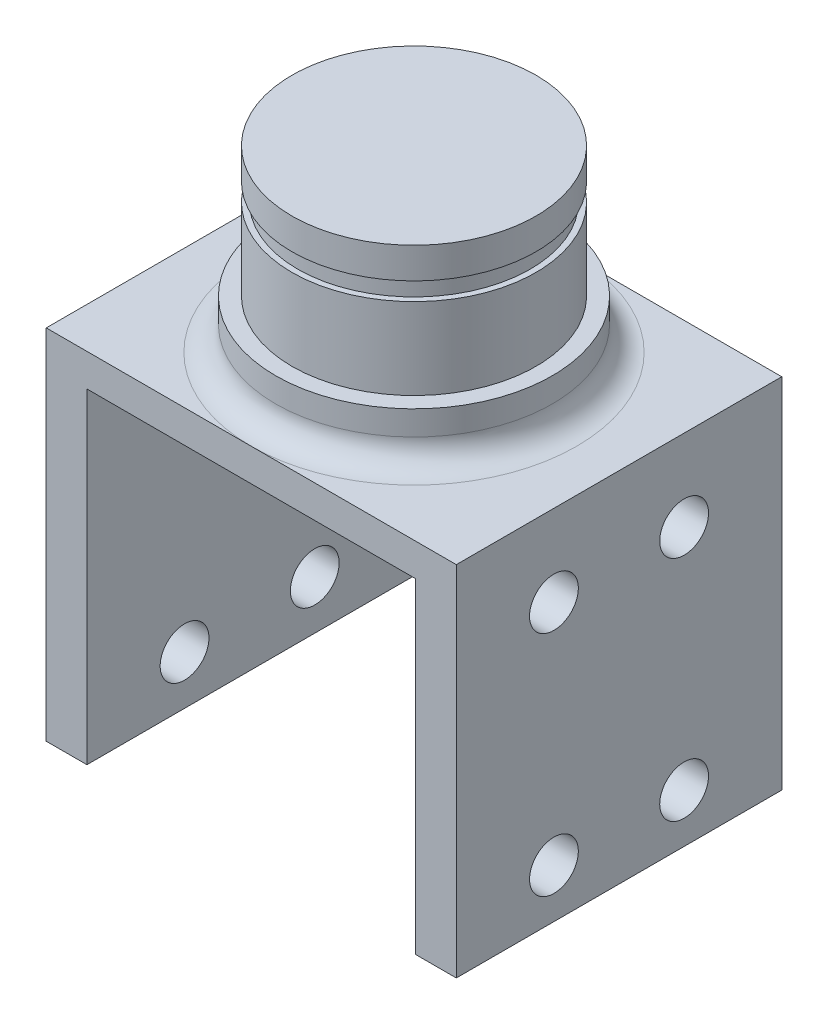
ISO-10303-21;
HEADER;
FILE_DESCRIPTION(('STEP AP214'),'2;1');
FILE_NAME('part.step','',(''),(''),'','','');
FILE_SCHEMA(('AUTOMOTIVE_DESIGN { 1 0 10303 214 1 1 1 1 }'));
ENDSEC;
DATA;
#1=APPLICATION_CONTEXT('core data for automotive mechanical design processes');
#2=APPLICATION_PROTOCOL_DEFINITION('international standard','automotive_design',2000,#1);
#3=PRODUCT_CONTEXT('',#1,'mechanical');
#4=PRODUCT('Part','Part','',(#3));
#5=PRODUCT_RELATED_PRODUCT_CATEGORY('part','',(#4));
#6=PRODUCT_DEFINITION_FORMATION('','',#4);
#7=PRODUCT_DEFINITION_CONTEXT('part definition',#1,'design');
#8=PRODUCT_DEFINITION('design','',#6,#7);
#9=PRODUCT_DEFINITION_SHAPE('','',#8);
#10=(LENGTH_UNIT() NAMED_UNIT(*) SI_UNIT(.MILLI.,.METRE.));
#11=(NAMED_UNIT(*) PLANE_ANGLE_UNIT() SI_UNIT($,.RADIAN.));
#12=(NAMED_UNIT(*) SI_UNIT($,.STERADIAN.) SOLID_ANGLE_UNIT());
#13=UNCERTAINTY_MEASURE_WITH_UNIT(LENGTH_MEASURE(1.E-05),#10,'distance_accuracy_value','');
#14=(GEOMETRIC_REPRESENTATION_CONTEXT(3) GLOBAL_UNCERTAINTY_ASSIGNED_CONTEXT((#13)) GLOBAL_UNIT_ASSIGNED_CONTEXT((#10,
#11,#12)) REPRESENTATION_CONTEXT('',''));
#15=CARTESIAN_POINT('',(0.,0.,0.));
#16=DIRECTION('',(0.,0.,1.));
#17=DIRECTION('',(1.,0.,0.));
#18=AXIS2_PLACEMENT_3D('',#15,#16,#17);
#19=CARTESIAN_POINT('',(0.,13.,0.));
#20=DIRECTION('',(0.,-1.,0.));
#21=DIRECTION('',(0.,0.,-1.));
#22=AXIS2_PLACEMENT_3D('',#19,#20,#21);
#23=CYLINDRICAL_SURFACE('',#22,7.5);
#24=CARTESIAN_POINT('',(0.,5.,0.));
#25=DIRECTION('',(0.,1.,0.));
#26=DIRECTION('',(0.,0.,1.));
#27=AXIS2_PLACEMENT_3D('',#24,#25,#26);
#28=CIRCLE('',#27,7.5);
#29=CARTESIAN_POINT('',(0.,5.,7.5));
#30=VERTEX_POINT('',#29);
#31=EDGE_CURVE('E174',#30,#30,#28,.T.);
#32=ORIENTED_EDGE('',*,*,#31,.T.);
#33=EDGE_LOOP('',(#32));
#34=FACE_BOUND('',#33,.T.);
#35=CARTESIAN_POINT('',(0.,10.,0.));
#36=DIRECTION('',(0.,1.,0.));
#37=DIRECTION('',(0.,0.,1.));
#38=AXIS2_PLACEMENT_3D('',#35,#36,#37);
#39=CIRCLE('',#38,7.5);
#40=CARTESIAN_POINT('',(0.,10.,7.5));
#41=VERTEX_POINT('',#40);
#42=EDGE_CURVE('E310',#41,#41,#39,.T.);
#43=ORIENTED_EDGE('',*,*,#42,.F.);
#44=EDGE_LOOP('',(#43));
#45=FACE_BOUND('',#44,.T.);
#46=ADVANCED_FACE('F33',(#34,#45),#23,.T.);
#47=CARTESIAN_POINT('',(0.,2.,0.));
#48=DIRECTION('',(0.,-1.,0.));
#49=DIRECTION('',(0.,0.,-1.));
#50=AXIS2_PLACEMENT_3D('',#47,#48,#49);
#51=PLANE('',#50);
#52=DIRECTION('',(1.,0.,0.));
#53=VECTOR('',#52,1.);
#54=CARTESIAN_POINT('',(12.6,2.,10.));
#55=LINE('',#54,#53);
#56=CARTESIAN_POINT('',(-12.6,2.,10.));
#57=VERTEX_POINT('',#56);
#58=CARTESIAN_POINT('',(0.,2.,10.));
#59=VERTEX_POINT('',#58);
#60=EDGE_CURVE('E156',#57,#59,#55,.T.);
#61=ORIENTED_EDGE('',*,*,#60,.T.);
#62=CARTESIAN_POINT('',(0.,2.,0.));
#63=DIRECTION('',(0.,-1.,0.));
#64=DIRECTION('',(0.,0.,-1.));
#65=AXIS2_PLACEMENT_3D('',#62,#63,#64);
#66=CIRCLE('',#65,10.);
#67=CARTESIAN_POINT('',(0.,2.,-10.));
#68=VERTEX_POINT('',#67);
#69=EDGE_CURVE('E11',#59,#68,#66,.T.);
#70=ORIENTED_EDGE('',*,*,#69,.T.);
#71=DIRECTION('',(-1.,0.,0.));
#72=VECTOR('',#71,1.);
#73=CARTESIAN_POINT('',(12.6,2.,-10.));
#74=LINE('',#73,#72);
#75=CARTESIAN_POINT('',(-12.6,2.,-10.));
#76=VERTEX_POINT('',#75);
#77=EDGE_CURVE('E161',#68,#76,#74,.T.);
#78=ORIENTED_EDGE('',*,*,#77,.T.);
#79=DIRECTION('',(0.,0.,1.));
#80=VECTOR('',#79,1.);
#81=CARTESIAN_POINT('',(-12.6,2.,-10.));
#82=LINE('',#81,#80);
#83=EDGE_CURVE('E151',#76,#57,#82,.T.);
#84=ORIENTED_EDGE('',*,*,#83,.T.);
#85=EDGE_LOOP('',(#61,#70,#78,#84));
#86=FACE_BOUND('',#85,.T.);
#87=ADVANCED_FACE('F278',(#86),#51,.F.);
#88=CARTESIAN_POINT('',(0.,0.,0.));
#89=DIRECTION('',(0.,-1.,0.));
#90=DIRECTION('',(0.,0.,-1.));
#91=AXIS2_PLACEMENT_3D('',#88,#89,#90);
#92=PLANE('',#91);
#93=DIRECTION('',(-1.,0.,0.));
#94=VECTOR('',#93,1.);
#95=CARTESIAN_POINT('',(12.6,0.,-10.));
#96=LINE('',#95,#94);
#97=CARTESIAN_POINT('',(10.1,0.,-9.99999999999999));
#98=VERTEX_POINT('',#97);
#99=CARTESIAN_POINT('',(-10.1,0.,-10.));
#100=VERTEX_POINT('',#99);
#101=EDGE_CURVE('E155',#98,#100,#96,.T.);
#102=ORIENTED_EDGE('',*,*,#101,.F.);
#103=DIRECTION('',(0.,0.,-1.));
#104=VECTOR('',#103,1.);
#105=CARTESIAN_POINT('',(10.1,0.,10.));
#106=LINE('',#105,#104);
#107=CARTESIAN_POINT('',(10.1,0.,10.));
#108=VERTEX_POINT('',#107);
#109=EDGE_CURVE('E121',#108,#98,#106,.T.);
#110=ORIENTED_EDGE('',*,*,#109,.F.);
#111=DIRECTION('',(1.,0.,0.));
#112=VECTOR('',#111,1.);
#113=CARTESIAN_POINT('',(12.6,0.,10.));
#114=LINE('',#113,#112);
#115=CARTESIAN_POINT('',(-10.1,0.,10.));
#116=VERTEX_POINT('',#115);
#117=EDGE_CURVE('E150',#116,#108,#114,.T.);
#118=ORIENTED_EDGE('',*,*,#117,.F.);
#119=DIRECTION('',(0.,0.,1.));
#120=VECTOR('',#119,1.);
#121=CARTESIAN_POINT('',(-10.1,0.,10.));
#122=LINE('',#121,#120);
#123=EDGE_CURVE('E126',#100,#116,#122,.T.);
#124=ORIENTED_EDGE('',*,*,#123,.F.);
#125=EDGE_LOOP('',(#102,#110,#118,#124));
#126=FACE_BOUND('',#125,.T.);
#127=ADVANCED_FACE('F245',(#126),#92,.T.);
#128=CARTESIAN_POINT('',(-12.6,2.,-10.));
#129=DIRECTION('',(1.,0.,0.));
#130=DIRECTION('',(0.,0.,-1.));
#131=AXIS2_PLACEMENT_3D('',#128,#129,#130);
#132=PLANE('',#131);
#133=CARTESIAN_POINT('',(-12.6,-3.,4.));
#134=DIRECTION('',(1.,0.,0.));
#135=DIRECTION('',(0.,0.,1.));
#136=AXIS2_PLACEMENT_3D('',#133,#134,#135);
#137=CIRCLE('',#136,1.5);
#138=CARTESIAN_POINT('',(-12.6,-3.,5.5));
#139=VERTEX_POINT('',#138);
#140=EDGE_CURVE('E221',#139,#139,#137,.T.);
#141=ORIENTED_EDGE('',*,*,#140,.T.);
#142=EDGE_LOOP('',(#141));
#143=FACE_BOUND('',#142,.T.);
#144=CARTESIAN_POINT('',(-12.6,-3.,-4.));
#145=DIRECTION('',(1.,0.,0.));
#146=DIRECTION('',(0.,0.,-1.));
#147=AXIS2_PLACEMENT_3D('',#144,#145,#146);
#148=CIRCLE('',#147,1.50000000000002);
#149=CARTESIAN_POINT('',(-12.6,-3.,-5.50000000000002));
#150=VERTEX_POINT('',#149);
#151=EDGE_CURVE('E215',#150,#150,#148,.T.);
#152=ORIENTED_EDGE('',*,*,#151,.T.);
#153=EDGE_LOOP('',(#152));
#154=FACE_BOUND('',#153,.T.);
#155=CARTESIAN_POINT('',(-12.6,-17.,-4.));
#156=DIRECTION('',(1.,0.,0.));
#157=DIRECTION('',(0.,0.,1.));
#158=AXIS2_PLACEMENT_3D('',#155,#156,#157);
#159=CIRCLE('',#158,1.50000000000002);
#160=CARTESIAN_POINT('',(-12.6,-17.,-2.49999999999998));
#161=VERTEX_POINT('',#160);
#162=EDGE_CURVE('E208',#161,#161,#159,.T.);
#163=ORIENTED_EDGE('',*,*,#162,.T.);
#164=EDGE_LOOP('',(#163));
#165=FACE_BOUND('',#164,.T.);
#166=CARTESIAN_POINT('',(-12.6,-17.,4.));
#167=DIRECTION('',(1.,0.,0.));
#168=DIRECTION('',(0.,0.,-1.));
#169=AXIS2_PLACEMENT_3D('',#166,#167,#168);
#170=CIRCLE('',#169,1.5);
#171=CARTESIAN_POINT('',(-12.6,-17.,2.50000000000001));
#172=VERTEX_POINT('',#171);
#173=EDGE_CURVE('E179',#172,#172,#170,.T.);
#174=ORIENTED_EDGE('',*,*,#173,.T.);
#175=EDGE_LOOP('',(#174));
#176=FACE_BOUND('',#175,.T.);
#177=DIRECTION('',(0.,-1.,0.));
#178=VECTOR('',#177,1.);
#179=CARTESIAN_POINT('',(-12.6,2.,-10.));
#180=LINE('',#179,#178);
#181=CARTESIAN_POINT('',(-12.6,-20.,-10.));
#182=VERTEX_POINT('',#181);
#183=EDGE_CURVE('E164',#76,#182,#180,.T.);
#184=ORIENTED_EDGE('',*,*,#183,.T.);
#185=DIRECTION('',(0.,0.,-1.));
#186=VECTOR('',#185,1.);
#187=CARTESIAN_POINT('',(-12.6,-20.,10.));
#188=LINE('',#187,#186);
#189=CARTESIAN_POINT('',(-12.6,-20.,10.));
#190=VERTEX_POINT('',#189);
#191=EDGE_CURVE('E130',#190,#182,#188,.T.);
#192=ORIENTED_EDGE('',*,*,#191,.F.);
#193=DIRECTION('',(0.,-1.,0.));
#194=VECTOR('',#193,1.);
#195=CARTESIAN_POINT('',(-12.6,2.,10.));
#196=LINE('',#195,#194);
#197=EDGE_CURVE('E172',#57,#190,#196,.T.);
#198=ORIENTED_EDGE('',*,*,#197,.F.);
#199=ORIENTED_EDGE('',*,*,#83,.F.);
#200=EDGE_LOOP('',(#184,#192,#198,#199));
#201=FACE_BOUND('',#200,.T.);
#202=ADVANCED_FACE('F260',(#143,#154,#165,#176,#201),#132,.F.);
#203=CARTESIAN_POINT('',(12.6,2.,10.));
#204=DIRECTION('',(0.,0.,-1.));
#205=DIRECTION('',(-1.,0.,0.));
#206=AXIS2_PLACEMENT_3D('',#203,#204,#205);
#207=PLANE('',#206);
#208=ORIENTED_EDGE('',*,*,#197,.T.);
#209=DIRECTION('',(-1.,0.,0.));
#210=VECTOR('',#209,1.);
#211=CARTESIAN_POINT('',(-10.1,-20.,10.));
#212=LINE('',#211,#210);
#213=CARTESIAN_POINT('',(-10.1,-20.,10.));
#214=VERTEX_POINT('',#213);
#215=EDGE_CURVE('E141',#214,#190,#212,.T.);
#216=ORIENTED_EDGE('',*,*,#215,.F.);
#217=DIRECTION('',(0.,1.,0.));
#218=VECTOR('',#217,1.);
#219=CARTESIAN_POINT('',(-10.1,-20.,10.));
#220=LINE('',#219,#218);
#221=EDGE_CURVE('E143',#214,#116,#220,.T.);
#222=ORIENTED_EDGE('',*,*,#221,.T.);
#223=ORIENTED_EDGE('',*,*,#117,.T.);
#224=DIRECTION('',(0.,1.,0.));
#225=VECTOR('',#224,1.);
#226=CARTESIAN_POINT('',(10.1,-20.,10.));
#227=LINE('',#226,#225);
#228=CARTESIAN_POINT('',(10.1,-20.,10.));
#229=VERTEX_POINT('',#228);
#230=EDGE_CURVE('E127',#229,#108,#227,.T.);
#231=ORIENTED_EDGE('',*,*,#230,.F.);
#232=DIRECTION('',(-1.,0.,0.));
#233=VECTOR('',#232,1.);
#234=CARTESIAN_POINT('',(10.1,-20.,10.));
#235=LINE('',#234,#233);
#236=CARTESIAN_POINT('',(12.6,-20.,10.));
#237=VERTEX_POINT('',#236);
#238=EDGE_CURVE('E118',#237,#229,#235,.T.);
#239=ORIENTED_EDGE('',*,*,#238,.F.);
#240=DIRECTION('',(0.,-1.,0.));
#241=VECTOR('',#240,1.);
#242=CARTESIAN_POINT('',(12.6,2.,10.));
#243=LINE('',#242,#241);
#244=CARTESIAN_POINT('',(12.6,2.,10.));
#245=VERTEX_POINT('',#244);
#246=EDGE_CURVE('E170',#245,#237,#243,.T.);
#247=ORIENTED_EDGE('',*,*,#246,.F.);
#248=EDGE_CURVE('E154',#59,#245,#55,.T.);
#249=ORIENTED_EDGE('',*,*,#248,.F.);
#250=ORIENTED_EDGE('',*,*,#60,.F.);
#251=EDGE_LOOP('',(#208,#216,#222,#223,#231,#239,#247,#249,#250));
#252=FACE_BOUND('',#251,.T.);
#253=ADVANCED_FACE('F242',(#252),#207,.F.);
#254=CARTESIAN_POINT('',(12.6,2.,-10.));
#255=DIRECTION('',(-1.,0.,0.));
#256=DIRECTION('',(0.,0.,1.));
#257=AXIS2_PLACEMENT_3D('',#254,#255,#256);
#258=PLANE('',#257);
#259=CARTESIAN_POINT('',(12.6,-3.,4.));
#260=DIRECTION('',(1.,0.,0.));
#261=DIRECTION('',(0.,0.,1.));
#262=AXIS2_PLACEMENT_3D('',#259,#260,#261);
#263=CIRCLE('',#262,1.5);
#264=CARTESIAN_POINT('',(12.6,-3.,5.5));
#265=VERTEX_POINT('',#264);
#266=EDGE_CURVE('E207',#265,#265,#263,.T.);
#267=ORIENTED_EDGE('',*,*,#266,.F.);
#268=EDGE_LOOP('',(#267));
#269=FACE_BOUND('',#268,.T.);
#270=CARTESIAN_POINT('',(12.6,-3.,-4.));
#271=DIRECTION('',(1.,0.,0.));
#272=DIRECTION('',(0.,0.,-1.));
#273=AXIS2_PLACEMENT_3D('',#270,#271,#272);
#274=CIRCLE('',#273,1.50000000000002);
#275=CARTESIAN_POINT('',(12.6,-3.,-5.50000000000002));
#276=VERTEX_POINT('',#275);
#277=EDGE_CURVE('E218',#276,#276,#274,.T.);
#278=ORIENTED_EDGE('',*,*,#277,.F.);
#279=EDGE_LOOP('',(#278));
#280=FACE_BOUND('',#279,.T.);
#281=CARTESIAN_POINT('',(12.6,-17.,-4.));
#282=DIRECTION('',(1.,0.,0.));
#283=DIRECTION('',(0.,0.,1.));
#284=AXIS2_PLACEMENT_3D('',#281,#282,#283);
#285=CIRCLE('',#284,1.50000000000002);
#286=CARTESIAN_POINT('',(12.6,-17.,-2.49999999999998));
#287=VERTEX_POINT('',#286);
#288=EDGE_CURVE('E212',#287,#287,#285,.T.);
#289=ORIENTED_EDGE('',*,*,#288,.F.);
#290=EDGE_LOOP('',(#289));
#291=FACE_BOUND('',#290,.T.);
#292=CARTESIAN_POINT('',(12.6,-17.,4.));
#293=DIRECTION('',(1.,0.,0.));
#294=DIRECTION('',(0.,0.,-1.));
#295=AXIS2_PLACEMENT_3D('',#292,#293,#294);
#296=CIRCLE('',#295,1.5);
#297=CARTESIAN_POINT('',(12.6,-17.,2.5));
#298=VERTEX_POINT('',#297);
#299=EDGE_CURVE('E211',#298,#298,#296,.T.);
#300=ORIENTED_EDGE('',*,*,#299,.F.);
#301=EDGE_LOOP('',(#300));
#302=FACE_BOUND('',#301,.T.);
#303=ORIENTED_EDGE('',*,*,#246,.T.);
#304=DIRECTION('',(0.,0.,1.));
#305=VECTOR('',#304,1.);
#306=CARTESIAN_POINT('',(12.6,-20.,10.));
#307=LINE('',#306,#305);
#308=CARTESIAN_POINT('',(12.6,-20.,-10.));
#309=VERTEX_POINT('',#308);
#310=EDGE_CURVE('E112',#309,#237,#307,.T.);
#311=ORIENTED_EDGE('',*,*,#310,.F.);
#312=DIRECTION('',(0.,-1.,0.));
#313=VECTOR('',#312,1.);
#314=CARTESIAN_POINT('',(12.6,2.,-10.));
#315=LINE('',#314,#313);
#316=CARTESIAN_POINT('',(12.6,2.,-10.));
#317=VERTEX_POINT('',#316);
#318=EDGE_CURVE('E108',#317,#309,#315,.T.);
#319=ORIENTED_EDGE('',*,*,#318,.F.);
#320=DIRECTION('',(0.,0.,-1.));
#321=VECTOR('',#320,1.);
#322=CARTESIAN_POINT('',(12.6,2.,-10.));
#323=LINE('',#322,#321);
#324=EDGE_CURVE('E159',#245,#317,#323,.T.);
#325=ORIENTED_EDGE('',*,*,#324,.F.);
#326=EDGE_LOOP('',(#303,#311,#319,#325));
#327=FACE_BOUND('',#326,.T.);
#328=ADVANCED_FACE('F265',(#269,#280,#291,#302,#327),#258,.F.);
#329=CARTESIAN_POINT('',(12.6,2.,-10.));
#330=DIRECTION('',(0.,0.,1.));
#331=DIRECTION('',(1.,0.,0.));
#332=AXIS2_PLACEMENT_3D('',#329,#330,#331);
#333=PLANE('',#332);
#334=ORIENTED_EDGE('',*,*,#318,.T.);
#335=DIRECTION('',(1.,0.,0.));
#336=VECTOR('',#335,1.);
#337=CARTESIAN_POINT('',(10.1,-20.,-9.99999999999999));
#338=LINE('',#337,#336);
#339=CARTESIAN_POINT('',(10.1,-20.,-9.99999999999999));
#340=VERTEX_POINT('',#339);
#341=EDGE_CURVE('E100',#340,#309,#338,.T.);
#342=ORIENTED_EDGE('',*,*,#341,.F.);
#343=DIRECTION('',(0.,1.,0.));
#344=VECTOR('',#343,1.);
#345=CARTESIAN_POINT('',(10.1,-20.,-9.99999999999999));
#346=LINE('',#345,#344);
#347=EDGE_CURVE('E104',#340,#98,#346,.T.);
#348=ORIENTED_EDGE('',*,*,#347,.T.);
#349=ORIENTED_EDGE('',*,*,#101,.T.);
#350=DIRECTION('',(0.,1.,0.));
#351=VECTOR('',#350,1.);
#352=CARTESIAN_POINT('',(-10.1,-20.,-10.));
#353=LINE('',#352,#351);
#354=CARTESIAN_POINT('',(-10.1,-20.,-10.));
#355=VERTEX_POINT('',#354);
#356=EDGE_CURVE('E147',#355,#100,#353,.T.);
#357=ORIENTED_EDGE('',*,*,#356,.F.);
#358=DIRECTION('',(1.,0.,0.));
#359=VECTOR('',#358,1.);
#360=CARTESIAN_POINT('',(-10.1,-20.,-10.));
#361=LINE('',#360,#359);
#362=EDGE_CURVE('E137',#182,#355,#361,.T.);
#363=ORIENTED_EDGE('',*,*,#362,.F.);
#364=ORIENTED_EDGE('',*,*,#183,.F.);
#365=ORIENTED_EDGE('',*,*,#77,.F.);
#366=EDGE_CURVE('E162',#317,#68,#74,.T.);
#367=ORIENTED_EDGE('',*,*,#366,.F.);
#368=EDGE_LOOP('',(#334,#342,#348,#349,#357,#363,#364,#365,#367));
#369=FACE_BOUND('',#368,.T.);
#370=ADVANCED_FACE('F102',(#369),#333,.F.);
#371=ORIENTED_EDGE('',*,*,#366,.T.);
#372=CARTESIAN_POINT('',(0.,2.,0.));
#373=DIRECTION('',(0.,-1.,0.));
#374=DIRECTION('',(0.,0.,-1.));
#375=AXIS2_PLACEMENT_3D('',#372,#373,#374);
#376=CIRCLE('',#375,10.);
#377=EDGE_CURVE('E41',#68,#59,#376,.T.);
#378=ORIENTED_EDGE('',*,*,#377,.T.);
#379=ORIENTED_EDGE('',*,*,#248,.T.);
#380=ORIENTED_EDGE('',*,*,#324,.T.);
#381=EDGE_LOOP('',(#371,#378,#379,#380));
#382=FACE_BOUND('',#381,.T.);
#383=ADVANCED_FACE('F264',(#382),#51,.F.);
#384=CARTESIAN_POINT('',(-10.1,-20.,10.));
#385=DIRECTION('',(-1.,0.,0.));
#386=DIRECTION('',(0.,0.,1.));
#387=AXIS2_PLACEMENT_3D('',#384,#385,#386);
#388=PLANE('',#387);
#389=CARTESIAN_POINT('',(-10.1,-3.,4.));
#390=DIRECTION('',(-1.,0.,0.));
#391=DIRECTION('',(0.,0.,1.));
#392=AXIS2_PLACEMENT_3D('',#389,#390,#391);
#393=CIRCLE('',#392,1.5);
#394=CARTESIAN_POINT('',(-10.1,-3.,5.5));
#395=VERTEX_POINT('',#394);
#396=EDGE_CURVE('E191',#395,#395,#393,.T.);
#397=ORIENTED_EDGE('',*,*,#396,.T.);
#398=EDGE_LOOP('',(#397));
#399=FACE_BOUND('',#398,.T.);
#400=CARTESIAN_POINT('',(-10.1,-3.,-4.));
#401=DIRECTION('',(-1.,0.,0.));
#402=DIRECTION('',(0.,0.,1.));
#403=AXIS2_PLACEMENT_3D('',#400,#401,#402);
#404=CIRCLE('',#403,1.50000000000002);
#405=CARTESIAN_POINT('',(-10.1,-3.,-2.49999999999998));
#406=VERTEX_POINT('',#405);
#407=EDGE_CURVE('E187',#406,#406,#404,.T.);
#408=ORIENTED_EDGE('',*,*,#407,.T.);
#409=EDGE_LOOP('',(#408));
#410=FACE_BOUND('',#409,.T.);
#411=CARTESIAN_POINT('',(-10.1,-17.,-4.));
#412=DIRECTION('',(-1.,0.,0.));
#413=DIRECTION('',(0.,0.,1.));
#414=AXIS2_PLACEMENT_3D('',#411,#412,#413);
#415=CIRCLE('',#414,1.50000000000002);
#416=CARTESIAN_POINT('',(-10.1,-17.,-2.49999999999998));
#417=VERTEX_POINT('',#416);
#418=EDGE_CURVE('E183',#417,#417,#415,.T.);
#419=ORIENTED_EDGE('',*,*,#418,.T.);
#420=EDGE_LOOP('',(#419));
#421=FACE_BOUND('',#420,.T.);
#422=CARTESIAN_POINT('',(-10.1,-17.,4.));
#423=DIRECTION('',(-1.,0.,0.));
#424=DIRECTION('',(0.,0.,1.));
#425=AXIS2_PLACEMENT_3D('',#422,#423,#424);
#426=CIRCLE('',#425,1.5);
#427=CARTESIAN_POINT('',(-10.1,-17.,5.5));
#428=VERTEX_POINT('',#427);
#429=EDGE_CURVE('E178',#428,#428,#426,.T.);
#430=ORIENTED_EDGE('',*,*,#429,.T.);
#431=EDGE_LOOP('',(#430));
#432=FACE_BOUND('',#431,.T.);
#433=ORIENTED_EDGE('',*,*,#123,.T.);
#434=ORIENTED_EDGE('',*,*,#221,.F.);
#435=DIRECTION('',(0.,0.,1.));
#436=VECTOR('',#435,1.);
#437=CARTESIAN_POINT('',(-10.1,-20.,10.));
#438=LINE('',#437,#436);
#439=EDGE_CURVE('E139',#355,#214,#438,.T.);
#440=ORIENTED_EDGE('',*,*,#439,.F.);
#441=ORIENTED_EDGE('',*,*,#356,.T.);
#442=EDGE_LOOP('',(#433,#434,#440,#441));
#443=FACE_BOUND('',#442,.T.);
#444=ADVANCED_FACE('F253',(#399,#410,#421,#432,#443),#388,.F.);
#445=CARTESIAN_POINT('',(0.,-20.,0.));
#446=DIRECTION('',(0.,1.,0.));
#447=DIRECTION('',(0.,0.,1.));
#448=AXIS2_PLACEMENT_3D('',#445,#446,#447);
#449=PLANE('',#448);
#450=ORIENTED_EDGE('',*,*,#191,.T.);
#451=ORIENTED_EDGE('',*,*,#362,.T.);
#452=ORIENTED_EDGE('',*,*,#439,.T.);
#453=ORIENTED_EDGE('',*,*,#215,.T.);
#454=EDGE_LOOP('',(#450,#451,#452,#453));
#455=FACE_BOUND('',#454,.T.);
#456=ADVANCED_FACE('F256',(#455),#449,.F.);
#457=CARTESIAN_POINT('',(10.1,-20.,10.));
#458=DIRECTION('',(1.,0.,0.));
#459=DIRECTION('',(0.,0.,-1.));
#460=AXIS2_PLACEMENT_3D('',#457,#458,#459);
#461=PLANE('',#460);
#462=CARTESIAN_POINT('',(10.1,-3.,4.));
#463=DIRECTION('',(1.,0.,0.));
#464=DIRECTION('',(0.,0.,-1.));
#465=AXIS2_PLACEMENT_3D('',#462,#463,#464);
#466=CIRCLE('',#465,1.5);
#467=CARTESIAN_POINT('',(10.1,-3.,2.5));
#468=VERTEX_POINT('',#467);
#469=EDGE_CURVE('E188',#468,#468,#466,.T.);
#470=ORIENTED_EDGE('',*,*,#469,.T.);
#471=EDGE_LOOP('',(#470));
#472=FACE_BOUND('',#471,.T.);
#473=CARTESIAN_POINT('',(10.1,-3.,-4.));
#474=DIRECTION('',(1.,0.,0.));
#475=DIRECTION('',(0.,0.,-1.));
#476=AXIS2_PLACEMENT_3D('',#473,#474,#475);
#477=CIRCLE('',#476,1.50000000000002);
#478=CARTESIAN_POINT('',(10.1,-3.,-5.50000000000002));
#479=VERTEX_POINT('',#478);
#480=EDGE_CURVE('E184',#479,#479,#477,.T.);
#481=ORIENTED_EDGE('',*,*,#480,.T.);
#482=EDGE_LOOP('',(#481));
#483=FACE_BOUND('',#482,.T.);
#484=CARTESIAN_POINT('',(10.1,-17.,-4.));
#485=DIRECTION('',(1.,0.,0.));
#486=DIRECTION('',(0.,0.,-1.));
#487=AXIS2_PLACEMENT_3D('',#484,#485,#486);
#488=CIRCLE('',#487,1.50000000000002);
#489=CARTESIAN_POINT('',(10.1,-17.,-5.50000000000002));
#490=VERTEX_POINT('',#489);
#491=EDGE_CURVE('E180',#490,#490,#488,.T.);
#492=ORIENTED_EDGE('',*,*,#491,.T.);
#493=EDGE_LOOP('',(#492));
#494=FACE_BOUND('',#493,.T.);
#495=CARTESIAN_POINT('',(10.1,-17.,4.));
#496=DIRECTION('',(1.,0.,0.));
#497=DIRECTION('',(0.,0.,-1.));
#498=AXIS2_PLACEMENT_3D('',#495,#496,#497);
#499=CIRCLE('',#498,1.5);
#500=CARTESIAN_POINT('',(10.1,-17.,2.5));
#501=VERTEX_POINT('',#500);
#502=EDGE_CURVE('E175',#501,#501,#499,.T.);
#503=ORIENTED_EDGE('',*,*,#502,.T.);
#504=EDGE_LOOP('',(#503));
#505=FACE_BOUND('',#504,.T.);
#506=ORIENTED_EDGE('',*,*,#109,.T.);
#507=ORIENTED_EDGE('',*,*,#347,.F.);
#508=DIRECTION('',(0.,0.,-1.));
#509=VECTOR('',#508,1.);
#510=CARTESIAN_POINT('',(10.1,-20.,10.));
#511=LINE('',#510,#509);
#512=EDGE_CURVE('E113',#229,#340,#511,.T.);
#513=ORIENTED_EDGE('',*,*,#512,.F.);
#514=ORIENTED_EDGE('',*,*,#230,.T.);
#515=EDGE_LOOP('',(#506,#507,#513,#514));
#516=FACE_BOUND('',#515,.T.);
#517=ADVANCED_FACE('F123',(#472,#483,#494,#505,#516),#461,.F.);
#518=CARTESIAN_POINT('',(0.,-20.,0.));
#519=DIRECTION('',(0.,-1.,0.));
#520=DIRECTION('',(0.,0.,-1.));
#521=AXIS2_PLACEMENT_3D('',#518,#519,#520);
#522=PLANE('',#521);
#523=ORIENTED_EDGE('',*,*,#512,.T.);
#524=ORIENTED_EDGE('',*,*,#341,.T.);
#525=ORIENTED_EDGE('',*,*,#310,.T.);
#526=ORIENTED_EDGE('',*,*,#238,.T.);
#527=EDGE_LOOP('',(#523,#524,#525,#526));
#528=FACE_BOUND('',#527,.T.);
#529=ADVANCED_FACE('F116',(#528),#522,.T.);
#530=CARTESIAN_POINT('',(-12.6,-17.,4.));
#531=DIRECTION('',(1.,0.,0.));
#532=DIRECTION('',(0.,0.,-1.));
#533=AXIS2_PLACEMENT_3D('',#530,#531,#532);
#534=CYLINDRICAL_SURFACE('',#533,1.5);
#535=ORIENTED_EDGE('',*,*,#299,.T.);
#536=EDGE_LOOP('',(#535));
#537=FACE_BOUND('',#536,.T.);
#538=ORIENTED_EDGE('',*,*,#502,.F.);
#539=EDGE_LOOP('',(#538));
#540=FACE_BOUND('',#539,.T.);
#541=ADVANCED_FACE('F363',(#537,#540),#534,.F.);
#542=CARTESIAN_POINT('',(-12.6,-17.,-4.));
#543=DIRECTION('',(1.,0.,0.));
#544=DIRECTION('',(0.,0.,-1.));
#545=AXIS2_PLACEMENT_3D('',#542,#543,#544);
#546=CYLINDRICAL_SURFACE('',#545,1.50000000000002);
#547=ORIENTED_EDGE('',*,*,#288,.T.);
#548=EDGE_LOOP('',(#547));
#549=FACE_BOUND('',#548,.T.);
#550=ORIENTED_EDGE('',*,*,#491,.F.);
#551=EDGE_LOOP('',(#550));
#552=FACE_BOUND('',#551,.T.);
#553=ADVANCED_FACE('F351',(#549,#552),#546,.F.);
#554=CARTESIAN_POINT('',(-12.6,-3.,-4.));
#555=DIRECTION('',(1.,0.,0.));
#556=DIRECTION('',(0.,0.,-1.));
#557=AXIS2_PLACEMENT_3D('',#554,#555,#556);
#558=CYLINDRICAL_SURFACE('',#557,1.50000000000002);
#559=ORIENTED_EDGE('',*,*,#277,.T.);
#560=EDGE_LOOP('',(#559));
#561=FACE_BOUND('',#560,.T.);
#562=ORIENTED_EDGE('',*,*,#480,.F.);
#563=EDGE_LOOP('',(#562));
#564=FACE_BOUND('',#563,.T.);
#565=ADVANCED_FACE('F355',(#561,#564),#558,.F.);
#566=CARTESIAN_POINT('',(-12.6,-3.,4.));
#567=DIRECTION('',(1.,0.,0.));
#568=DIRECTION('',(0.,0.,-1.));
#569=AXIS2_PLACEMENT_3D('',#566,#567,#568);
#570=CYLINDRICAL_SURFACE('',#569,1.5);
#571=ORIENTED_EDGE('',*,*,#266,.T.);
#572=EDGE_LOOP('',(#571));
#573=FACE_BOUND('',#572,.T.);
#574=ORIENTED_EDGE('',*,*,#469,.F.);
#575=EDGE_LOOP('',(#574));
#576=FACE_BOUND('',#575,.T.);
#577=ADVANCED_FACE('F359',(#573,#576),#570,.F.);
#578=ORIENTED_EDGE('',*,*,#173,.F.);
#579=EDGE_LOOP('',(#578));
#580=FACE_BOUND('',#579,.T.);
#581=ORIENTED_EDGE('',*,*,#429,.F.);
#582=EDGE_LOOP('',(#581));
#583=FACE_BOUND('',#582,.T.);
#584=ADVANCED_FACE('F349',(#580,#583),#534,.F.);
#585=ORIENTED_EDGE('',*,*,#162,.F.);
#586=EDGE_LOOP('',(#585));
#587=FACE_BOUND('',#586,.T.);
#588=ORIENTED_EDGE('',*,*,#418,.F.);
#589=EDGE_LOOP('',(#588));
#590=FACE_BOUND('',#589,.T.);
#591=ADVANCED_FACE('F345',(#587,#590),#546,.F.);
#592=ORIENTED_EDGE('',*,*,#151,.F.);
#593=EDGE_LOOP('',(#592));
#594=FACE_BOUND('',#593,.T.);
#595=ORIENTED_EDGE('',*,*,#407,.F.);
#596=EDGE_LOOP('',(#595));
#597=FACE_BOUND('',#596,.T.);
#598=ADVANCED_FACE('F348',(#594,#597),#558,.F.);
#599=ORIENTED_EDGE('',*,*,#140,.F.);
#600=EDGE_LOOP('',(#599));
#601=FACE_BOUND('',#600,.T.);
#602=ORIENTED_EDGE('',*,*,#396,.F.);
#603=EDGE_LOOP('',(#602));
#604=FACE_BOUND('',#603,.T.);
#605=ADVANCED_FACE('F341',(#601,#604),#570,.F.);
#606=CARTESIAN_POINT('',(0.,5.,0.));
#607=DIRECTION('',(0.,-1.,0.));
#608=DIRECTION('',(0.,0.,-1.));
#609=AXIS2_PLACEMENT_3D('',#606,#607,#608);
#610=CYLINDRICAL_SURFACE('',#609,8.5);
#611=CARTESIAN_POINT('',(0.,3.5,0.));
#612=DIRECTION('',(0.,-1.,0.));
#613=DIRECTION('',(0.,0.,-1.));
#614=AXIS2_PLACEMENT_3D('',#611,#612,#613);
#615=CIRCLE('',#614,8.5);
#616=CARTESIAN_POINT('',(0.,3.5,-8.5));
#617=VERTEX_POINT('',#616);
#618=EDGE_CURVE('E192',#617,#617,#615,.F.);
#619=ORIENTED_EDGE('',*,*,#618,.T.);
#620=EDGE_LOOP('',(#619));
#621=FACE_BOUND('',#620,.T.);
#622=CARTESIAN_POINT('',(0.,5.,0.));
#623=DIRECTION('',(0.,1.,0.));
#624=DIRECTION('',(0.,0.,1.));
#625=AXIS2_PLACEMENT_3D('',#622,#623,#624);
#626=CIRCLE('',#625,8.5);
#627=CARTESIAN_POINT('',(0.,5.,8.5));
#628=VERTEX_POINT('',#627);
#629=EDGE_CURVE('E204',#628,#628,#626,.T.);
#630=ORIENTED_EDGE('',*,*,#629,.F.);
#631=EDGE_LOOP('',(#630));
#632=FACE_BOUND('',#631,.T.);
#633=ADVANCED_FACE('F335',(#621,#632),#610,.T.);
#634=CARTESIAN_POINT('',(0.,5.,0.));
#635=DIRECTION('',(0.,1.,0.));
#636=DIRECTION('',(0.,0.,1.));
#637=AXIS2_PLACEMENT_3D('',#634,#635,#636);
#638=PLANE('',#637);
#639=ORIENTED_EDGE('',*,*,#31,.F.);
#640=EDGE_LOOP('',(#639));
#641=FACE_BOUND('',#640,.T.);
#642=ORIENTED_EDGE('',*,*,#629,.T.);
#643=EDGE_LOOP('',(#642));
#644=FACE_BOUND('',#643,.T.);
#645=ADVANCED_FACE('F331',(#641,#644),#638,.T.);
#646=CARTESIAN_POINT('',(0.,3.5,0.));
#647=DIRECTION('',(0.,-1.,0.));
#648=DIRECTION('',(0.,0.,-1.));
#649=AXIS2_PLACEMENT_3D('',#646,#647,#648);
#650=TOROIDAL_SURFACE('',#649,10.,1.5);
#651=ORIENTED_EDGE('',*,*,#377,.F.);
#652=ORIENTED_EDGE('',*,*,#69,.F.);
#653=EDGE_LOOP('',(#651,#652));
#654=FACE_BOUND('',#653,.T.);
#655=ORIENTED_EDGE('',*,*,#618,.F.);
#656=EDGE_LOOP('',(#655));
#657=FACE_BOUND('',#656,.T.);
#658=ADVANCED_FACE('F35',(#654,#657),#650,.F.);
#659=CARTESIAN_POINT('',(0.,11.1,-7.5));
#660=DIRECTION('',(0.,-1.,0.));
#661=DIRECTION('',(0.,0.,-1.));
#662=AXIS2_PLACEMENT_3D('',#659,#660,#661);
#663=PLANE('',#662);
#664=CARTESIAN_POINT('',(0.,11.1,0.));
#665=DIRECTION('',(0.,1.,0.));
#666=DIRECTION('',(0.,0.,1.));
#667=AXIS2_PLACEMENT_3D('',#664,#665,#666);
#668=CIRCLE('',#667,7.15);
#669=CARTESIAN_POINT('',(0.,11.1,7.15));
#670=VERTEX_POINT('',#669);
#671=EDGE_CURVE('E303',#670,#670,#668,.T.);
#672=ORIENTED_EDGE('',*,*,#671,.T.);
#673=EDGE_LOOP('',(#672));
#674=FACE_BOUND('',#673,.T.);
#675=CARTESIAN_POINT('',(0.,11.1,0.));
#676=DIRECTION('',(0.,1.,0.));
#677=DIRECTION('',(0.,0.,1.));
#678=AXIS2_PLACEMENT_3D('',#675,#676,#677);
#679=CIRCLE('',#678,7.5);
#680=CARTESIAN_POINT('',(0.,11.1,7.5));
#681=VERTEX_POINT('',#680);
#682=EDGE_CURVE('E301',#681,#681,#679,.T.);
#683=ORIENTED_EDGE('',*,*,#682,.F.);
#684=EDGE_LOOP('',(#683));
#685=FACE_BOUND('',#684,.T.);
#686=ADVANCED_FACE('F322',(#674,#685),#663,.T.);
#687=CARTESIAN_POINT('',(0.,13.,0.));
#688=DIRECTION('',(0.,1.,0.));
#689=DIRECTION('',(0.,0.,1.));
#690=AXIS2_PLACEMENT_3D('',#687,#688,#689);
#691=CYLINDRICAL_SURFACE('',#690,7.15);
#692=CARTESIAN_POINT('',(0.,10.,0.));
#693=DIRECTION('',(0.,1.,0.));
#694=DIRECTION('',(0.,0.,1.));
#695=AXIS2_PLACEMENT_3D('',#692,#693,#694);
#696=CIRCLE('',#695,7.15);
#697=CARTESIAN_POINT('',(0.,10.,7.15));
#698=VERTEX_POINT('',#697);
#699=EDGE_CURVE('E305',#698,#698,#696,.T.);
#700=ORIENTED_EDGE('',*,*,#699,.T.);
#701=EDGE_LOOP('',(#700));
#702=FACE_BOUND('',#701,.T.);
#703=ORIENTED_EDGE('',*,*,#671,.F.);
#704=EDGE_LOOP('',(#703));
#705=FACE_BOUND('',#704,.T.);
#706=ADVANCED_FACE('F316',(#702,#705),#691,.T.);
#707=CARTESIAN_POINT('',(0.,10.,-7.15));
#708=DIRECTION('',(0.,1.,0.));
#709=DIRECTION('',(0.,0.,1.));
#710=AXIS2_PLACEMENT_3D('',#707,#708,#709);
#711=PLANE('',#710);
#712=ORIENTED_EDGE('',*,*,#42,.T.);
#713=EDGE_LOOP('',(#712));
#714=FACE_BOUND('',#713,.T.);
#715=ORIENTED_EDGE('',*,*,#699,.F.);
#716=EDGE_LOOP('',(#715));
#717=FACE_BOUND('',#716,.T.);
#718=ADVANCED_FACE('F294',(#714,#717),#711,.T.);
#719=CARTESIAN_POINT('',(0.,13.,0.));
#720=DIRECTION('',(0.,1.,0.));
#721=DIRECTION('',(0.,0.,1.));
#722=AXIS2_PLACEMENT_3D('',#719,#720,#721);
#723=PLANE('',#722);
#724=CARTESIAN_POINT('',(0.,13.,0.));
#725=DIRECTION('',(0.,1.,0.));
#726=DIRECTION('',(0.,0.,1.));
#727=AXIS2_PLACEMENT_3D('',#724,#725,#726);
#728=CIRCLE('',#727,7.5);
#729=CARTESIAN_POINT('',(0.,13.,7.5));
#730=VERTEX_POINT('',#729);
#731=EDGE_CURVE('E202',#730,#730,#728,.T.);
#732=ORIENTED_EDGE('',*,*,#731,.T.);
#733=EDGE_LOOP('',(#732));
#734=FACE_BOUND('',#733,.T.);
#735=ADVANCED_FACE('F289',(#734),#723,.T.);
#736=ORIENTED_EDGE('',*,*,#731,.F.);
#737=EDGE_LOOP('',(#736));
#738=FACE_BOUND('',#737,.T.);
#739=ORIENTED_EDGE('',*,*,#682,.T.);
#740=EDGE_LOOP('',(#739));
#741=FACE_BOUND('',#740,.T.);
#742=ADVANCED_FACE('F280',(#738,#741),#23,.T.);
#743=CLOSED_SHELL('',(#46,#87,#127,#202,#253,#328,#370,#383,#444,#456,#517,#529,#541,#553,#565,
#577,#584,#591,#598,#605,#633,#645,#658,#686,#706,#718,#735,#742));
#744=MANIFOLD_SOLID_BREP('B2',#743);
#745=ADVANCED_BREP_SHAPE_REPRESENTATION('',(#18,#744),#14);
#746=SHAPE_DEFINITION_REPRESENTATION(#9,#745);
ENDSEC;
END-ISO-10303-21;
